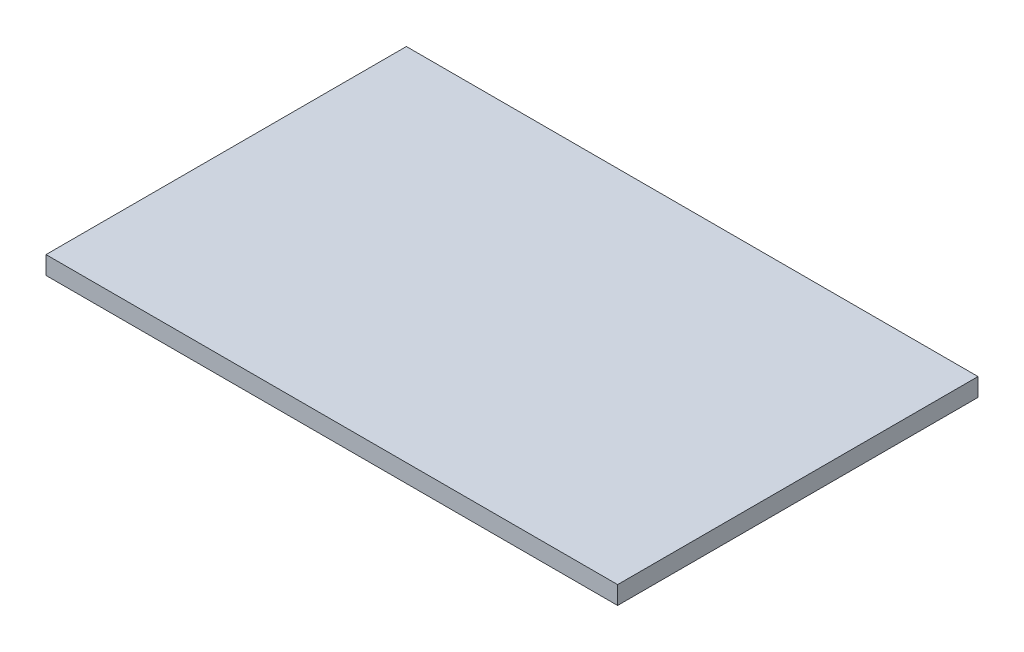
ISO-10303-21;
HEADER;
FILE_DESCRIPTION(('STEP AP214'),'2;1');
FILE_NAME('part.step','',(''),(''),'','','');
FILE_SCHEMA(('AUTOMOTIVE_DESIGN { 1 0 10303 214 1 1 1 1 }'));
ENDSEC;
DATA;
#1=APPLICATION_CONTEXT('core data for automotive mechanical design processes');
#2=APPLICATION_PROTOCOL_DEFINITION('international standard','automotive_design',2000,#1);
#3=PRODUCT_CONTEXT('',#1,'mechanical');
#4=PRODUCT('Part','Part','',(#3));
#5=PRODUCT_RELATED_PRODUCT_CATEGORY('part','',(#4));
#6=PRODUCT_DEFINITION_FORMATION('','',#4);
#7=PRODUCT_DEFINITION_CONTEXT('part definition',#1,'design');
#8=PRODUCT_DEFINITION('design','',#6,#7);
#9=PRODUCT_DEFINITION_SHAPE('','',#8);
#10=(LENGTH_UNIT() NAMED_UNIT(*) SI_UNIT(.MILLI.,.METRE.));
#11=(NAMED_UNIT(*) PLANE_ANGLE_UNIT() SI_UNIT($,.RADIAN.));
#12=(NAMED_UNIT(*) SI_UNIT($,.STERADIAN.) SOLID_ANGLE_UNIT());
#13=UNCERTAINTY_MEASURE_WITH_UNIT(LENGTH_MEASURE(1.E-05),#10,'distance_accuracy_value','');
#14=(GEOMETRIC_REPRESENTATION_CONTEXT(3) GLOBAL_UNCERTAINTY_ASSIGNED_CONTEXT((#13)) GLOBAL_UNIT_ASSIGNED_CONTEXT((#10,
#11,#12)) REPRESENTATION_CONTEXT('',''));
#15=CARTESIAN_POINT('',(0.,0.,0.));
#16=DIRECTION('',(0.,0.,1.));
#17=DIRECTION('',(1.,0.,0.));
#18=AXIS2_PLACEMENT_3D('',#15,#16,#17);
#19=CARTESIAN_POINT('',(-401.000921275294,25.4,-252.81667539229));
#20=DIRECTION('',(1.,0.,0.));
#21=DIRECTION('',(0.,0.,-1.));
#22=AXIS2_PLACEMENT_3D('',#19,#20,#21);
#23=PLANE('',#22);
#24=DIRECTION('',(0.,0.,1.));
#25=VECTOR('',#24,1.);
#26=CARTESIAN_POINT('',(-401.000921275294,0.,-252.81667539229));
#27=LINE('',#26,#25);
#28=CARTESIAN_POINT('',(-401.000921275294,0.,-252.81667539229));
#29=VERTEX_POINT('',#28);
#30=CARTESIAN_POINT('',(-401.000921275294,0.,252.81667539229));
#31=VERTEX_POINT('',#30);
#32=EDGE_CURVE('E10',#29,#31,#27,.T.);
#33=ORIENTED_EDGE('',*,*,#32,.T.);
#34=DIRECTION('',(0.,-1.,0.));
#35=VECTOR('',#34,1.);
#36=CARTESIAN_POINT('',(-401.000921275294,25.4,252.81667539229));
#37=LINE('',#36,#35);
#38=CARTESIAN_POINT('',(-401.000921275294,25.4,252.81667539229));
#39=VERTEX_POINT('',#38);
#40=EDGE_CURVE('E35',#39,#31,#37,.T.);
#41=ORIENTED_EDGE('',*,*,#40,.F.);
#42=DIRECTION('',(0.,0.,1.));
#43=VECTOR('',#42,1.);
#44=CARTESIAN_POINT('',(-401.000921275294,25.4,-252.81667539229));
#45=LINE('',#44,#43);
#46=CARTESIAN_POINT('',(-401.000921275294,25.4,-252.81667539229));
#47=VERTEX_POINT('',#46);
#48=EDGE_CURVE('E72',#47,#39,#45,.T.);
#49=ORIENTED_EDGE('',*,*,#48,.F.);
#50=DIRECTION('',(0.,-1.,0.));
#51=VECTOR('',#50,1.);
#52=CARTESIAN_POINT('',(-401.000921275294,25.4,-252.81667539229));
#53=LINE('',#52,#51);
#54=EDGE_CURVE('E26',#47,#29,#53,.T.);
#55=ORIENTED_EDGE('',*,*,#54,.T.);
#56=EDGE_LOOP('',(#33,#41,#49,#55));
#57=FACE_BOUND('',#56,.T.);
#58=ADVANCED_FACE('F16',(#57),#23,.F.);
#59=CARTESIAN_POINT('',(401.000921275294,25.4,252.81667539229));
#60=DIRECTION('',(0.,0.,-1.));
#61=DIRECTION('',(-1.,0.,0.));
#62=AXIS2_PLACEMENT_3D('',#59,#60,#61);
#63=PLANE('',#62);
#64=DIRECTION('',(1.,0.,0.));
#65=VECTOR('',#64,1.);
#66=CARTESIAN_POINT('',(401.000921275294,0.,252.81667539229));
#67=LINE('',#66,#65);
#68=CARTESIAN_POINT('',(401.000921275294,0.,252.81667539229));
#69=VERTEX_POINT('',#68);
#70=EDGE_CURVE('E79',#31,#69,#67,.T.);
#71=ORIENTED_EDGE('',*,*,#70,.T.);
#72=DIRECTION('',(0.,-1.,0.));
#73=VECTOR('',#72,1.);
#74=CARTESIAN_POINT('',(401.000921275294,25.4,252.81667539229));
#75=LINE('',#74,#73);
#76=CARTESIAN_POINT('',(401.000921275294,25.4,252.81667539229));
#77=VERTEX_POINT('',#76);
#78=EDGE_CURVE('E85',#77,#69,#75,.T.);
#79=ORIENTED_EDGE('',*,*,#78,.F.);
#80=DIRECTION('',(1.,0.,0.));
#81=VECTOR('',#80,1.);
#82=CARTESIAN_POINT('',(401.000921275294,25.4,252.81667539229));
#83=LINE('',#82,#81);
#84=EDGE_CURVE('E63',#39,#77,#83,.T.);
#85=ORIENTED_EDGE('',*,*,#84,.F.);
#86=ORIENTED_EDGE('',*,*,#40,.T.);
#87=EDGE_LOOP('',(#71,#79,#85,#86));
#88=FACE_BOUND('',#87,.T.);
#89=ADVANCED_FACE('F89',(#88),#63,.F.);
#90=CARTESIAN_POINT('',(401.000921275294,25.4,-252.81667539229));
#91=DIRECTION('',(-1.,0.,0.));
#92=DIRECTION('',(0.,0.,1.));
#93=AXIS2_PLACEMENT_3D('',#90,#91,#92);
#94=PLANE('',#93);
#95=DIRECTION('',(0.,0.,-1.));
#96=VECTOR('',#95,1.);
#97=CARTESIAN_POINT('',(401.000921275294,0.,-252.81667539229));
#98=LINE('',#97,#96);
#99=CARTESIAN_POINT('',(401.000921275294,0.,-252.81667539229));
#100=VERTEX_POINT('',#99);
#101=EDGE_CURVE('E69',#69,#100,#98,.T.);
#102=ORIENTED_EDGE('',*,*,#101,.T.);
#103=DIRECTION('',(0.,-1.,0.));
#104=VECTOR('',#103,1.);
#105=CARTESIAN_POINT('',(401.000921275294,25.4,-252.81667539229));
#106=LINE('',#105,#104);
#107=CARTESIAN_POINT('',(401.000921275294,25.4,-252.81667539229));
#108=VERTEX_POINT('',#107);
#109=EDGE_CURVE('E55',#108,#100,#106,.T.);
#110=ORIENTED_EDGE('',*,*,#109,.F.);
#111=DIRECTION('',(0.,0.,-1.));
#112=VECTOR('',#111,1.);
#113=CARTESIAN_POINT('',(401.000921275294,25.4,-252.81667539229));
#114=LINE('',#113,#112);
#115=EDGE_CURVE('E61',#77,#108,#114,.T.);
#116=ORIENTED_EDGE('',*,*,#115,.F.);
#117=ORIENTED_EDGE('',*,*,#78,.T.);
#118=EDGE_LOOP('',(#102,#110,#116,#117));
#119=FACE_BOUND('',#118,.T.);
#120=ADVANCED_FACE('F67',(#119),#94,.F.);
#121=CARTESIAN_POINT('',(401.000921275294,25.4,-252.81667539229));
#122=DIRECTION('',(0.,0.,1.));
#123=DIRECTION('',(1.,0.,0.));
#124=AXIS2_PLACEMENT_3D('',#121,#122,#123);
#125=PLANE('',#124);
#126=DIRECTION('',(-1.,0.,0.));
#127=VECTOR('',#126,1.);
#128=CARTESIAN_POINT('',(401.000921275294,0.,-252.81667539229));
#129=LINE('',#128,#127);
#130=EDGE_CURVE('E71',#100,#29,#129,.T.);
#131=ORIENTED_EDGE('',*,*,#130,.T.);
#132=ORIENTED_EDGE('',*,*,#54,.F.);
#133=DIRECTION('',(-1.,0.,0.));
#134=VECTOR('',#133,1.);
#135=CARTESIAN_POINT('',(401.000921275294,25.4,-252.81667539229));
#136=LINE('',#135,#134);
#137=EDGE_CURVE('E20',#108,#47,#136,.T.);
#138=ORIENTED_EDGE('',*,*,#137,.F.);
#139=ORIENTED_EDGE('',*,*,#109,.T.);
#140=EDGE_LOOP('',(#131,#132,#138,#139));
#141=FACE_BOUND('',#140,.T.);
#142=ADVANCED_FACE('F75',(#141),#125,.F.);
#143=CARTESIAN_POINT('',(0.,25.4,0.));
#144=DIRECTION('',(0.,-1.,0.));
#145=DIRECTION('',(0.,0.,-1.));
#146=AXIS2_PLACEMENT_3D('',#143,#144,#145);
#147=PLANE('',#146);
#148=ORIENTED_EDGE('',*,*,#48,.T.);
#149=ORIENTED_EDGE('',*,*,#84,.T.);
#150=ORIENTED_EDGE('',*,*,#115,.T.);
#151=ORIENTED_EDGE('',*,*,#137,.T.);
#152=EDGE_LOOP('',(#148,#149,#150,#151));
#153=FACE_BOUND('',#152,.T.);
#154=ADVANCED_FACE('F62',(#153),#147,.F.);
#155=CARTESIAN_POINT('',(0.,0.,0.));
#156=DIRECTION('',(0.,-1.,0.));
#157=DIRECTION('',(0.,0.,-1.));
#158=AXIS2_PLACEMENT_3D('',#155,#156,#157);
#159=PLANE('',#158);
#160=ORIENTED_EDGE('',*,*,#32,.F.);
#161=ORIENTED_EDGE('',*,*,#130,.F.);
#162=ORIENTED_EDGE('',*,*,#101,.F.);
#163=ORIENTED_EDGE('',*,*,#70,.F.);
#164=EDGE_LOOP('',(#160,#161,#162,#163));
#165=FACE_BOUND('',#164,.T.);
#166=ADVANCED_FACE('F18',(#165),#159,.T.);
#167=CLOSED_SHELL('',(#58,#89,#120,#142,#154,#166));
#168=MANIFOLD_SOLID_BREP('B1',#167);
#169=ADVANCED_BREP_SHAPE_REPRESENTATION('',(#18,#168),#14);
#170=SHAPE_DEFINITION_REPRESENTATION(#9,#169);
ENDSEC;
END-ISO-10303-21;
